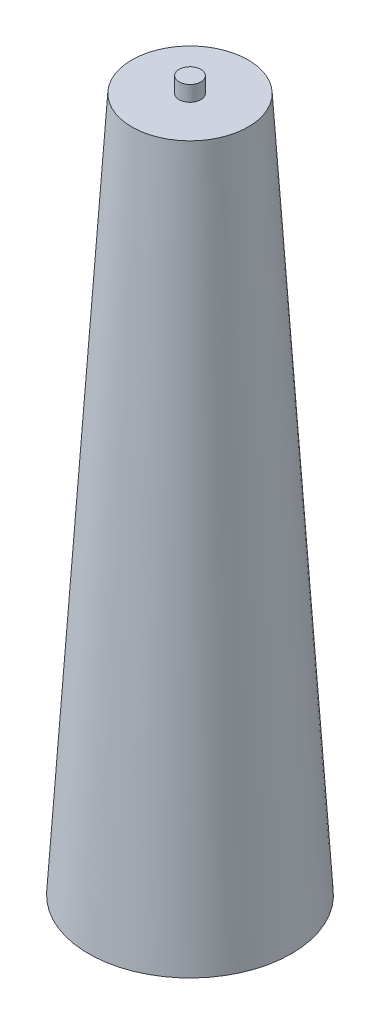
ISO-10303-21;
HEADER;
FILE_DESCRIPTION(('STEP AP214'),'2;1');
FILE_NAME('part.step','',(''),(''),'','','');
FILE_SCHEMA(('AUTOMOTIVE_DESIGN { 1 0 10303 214 1 1 1 1 }'));
ENDSEC;
DATA;
#1=APPLICATION_CONTEXT('core data for automotive mechanical design processes');
#2=APPLICATION_PROTOCOL_DEFINITION('international standard','automotive_design',2000,#1);
#3=PRODUCT_CONTEXT('',#1,'mechanical');
#4=PRODUCT('Part','Part','',(#3));
#5=PRODUCT_RELATED_PRODUCT_CATEGORY('part','',(#4));
#6=PRODUCT_DEFINITION_FORMATION('','',#4);
#7=PRODUCT_DEFINITION_CONTEXT('part definition',#1,'design');
#8=PRODUCT_DEFINITION('design','',#6,#7);
#9=PRODUCT_DEFINITION_SHAPE('','',#8);
#10=(LENGTH_UNIT() NAMED_UNIT(*) SI_UNIT(.MILLI.,.METRE.));
#11=(NAMED_UNIT(*) PLANE_ANGLE_UNIT() SI_UNIT($,.RADIAN.));
#12=(NAMED_UNIT(*) SI_UNIT($,.STERADIAN.) SOLID_ANGLE_UNIT());
#13=UNCERTAINTY_MEASURE_WITH_UNIT(LENGTH_MEASURE(1.E-05),#10,'distance_accuracy_value','');
#14=(GEOMETRIC_REPRESENTATION_CONTEXT(3) GLOBAL_UNCERTAINTY_ASSIGNED_CONTEXT((#13)) GLOBAL_UNIT_ASSIGNED_CONTEXT((#10,
#11,#12)) REPRESENTATION_CONTEXT('',''));
#15=CARTESIAN_POINT('',(0.,0.,0.));
#16=DIRECTION('',(0.,0.,1.));
#17=DIRECTION('',(1.,0.,0.));
#18=AXIS2_PLACEMENT_3D('',#15,#16,#17);
#19=CARTESIAN_POINT('',(0.,0.,0.));
#20=DIRECTION('',(0.,-1.,0.));
#21=DIRECTION('',(1.,0.,0.));
#22=AXIS2_PLACEMENT_3D('',#19,#20,#21);
#23=PLANE('',#22);
#24=CARTESIAN_POINT('',(0.,0.,0.));
#25=DIRECTION('',(0.,-1.,0.));
#26=DIRECTION('',(1.,0.,0.));
#27=AXIS2_PLACEMENT_3D('',#24,#25,#26);
#28=CIRCLE('',#27,3.5814);
#29=CARTESIAN_POINT('',(3.5814,0.,0.));
#30=VERTEX_POINT('',#29);
#31=EDGE_CURVE('E95',#30,#30,#28,.T.);
#32=ORIENTED_EDGE('',*,*,#31,.F.);
#33=EDGE_LOOP('',(#32));
#34=FACE_BOUND('',#33,.T.);
#35=CARTESIAN_POINT('',(0.,0.,0.));
#36=DIRECTION('',(0.,1.,0.));
#37=DIRECTION('',(-1.,0.,0.));
#38=AXIS2_PLACEMENT_3D('',#35,#36,#37);
#39=CIRCLE('',#38,33.401);
#40=CARTESIAN_POINT('',(-33.401,0.,0.));
#41=VERTEX_POINT('',#40);
#42=EDGE_CURVE('E64',#41,#41,#39,.T.);
#43=ORIENTED_EDGE('',*,*,#42,.F.);
#44=EDGE_LOOP('',(#43));
#45=FACE_BOUND('',#44,.T.);
#46=ADVANCED_FACE('F46',(#34,#45),#23,.T.);
#47=CARTESIAN_POINT('',(0.,228.6,0.));
#48=DIRECTION('',(0.,-1.,0.));
#49=DIRECTION('',(1.,0.,0.));
#50=AXIS2_PLACEMENT_3D('',#47,#48,#49);
#51=CONICAL_SURFACE('',#50,19.1388715805443,0.0623082542961904);
#52=ORIENTED_EDGE('',*,*,#42,.T.);
#53=EDGE_LOOP('',(#52));
#54=FACE_BOUND('',#53,.T.);
#55=CARTESIAN_POINT('',(0.,228.6,0.));
#56=DIRECTION('',(0.,1.,0.));
#57=DIRECTION('',(-1.,0.,0.));
#58=AXIS2_PLACEMENT_3D('',#55,#56,#57);
#59=CIRCLE('',#58,19.1388715805443);
#60=CARTESIAN_POINT('',(-19.1388715805443,228.6,0.));
#61=VERTEX_POINT('',#60);
#62=EDGE_CURVE('E84',#61,#61,#59,.T.);
#63=ORIENTED_EDGE('',*,*,#62,.F.);
#64=EDGE_LOOP('',(#63));
#65=FACE_BOUND('',#64,.T.);
#66=ADVANCED_FACE('F106',(#54,#65),#51,.T.);
#67=CARTESIAN_POINT('',(-19.1388715805443,228.6,0.));
#68=DIRECTION('',(0.,1.,0.));
#69=DIRECTION('',(-1.,0.,0.));
#70=AXIS2_PLACEMENT_3D('',#67,#68,#69);
#71=PLANE('',#70);
#72=CARTESIAN_POINT('',(0.,228.6,0.));
#73=DIRECTION('',(0.,1.,0.));
#74=DIRECTION('',(-1.,0.,0.));
#75=AXIS2_PLACEMENT_3D('',#72,#73,#74);
#76=CIRCLE('',#75,3.5814);
#77=CARTESIAN_POINT('',(-3.58140000000002,228.6,0.));
#78=VERTEX_POINT('',#77);
#79=EDGE_CURVE('E75',#78,#78,#76,.T.);
#80=ORIENTED_EDGE('',*,*,#79,.F.);
#81=EDGE_LOOP('',(#80));
#82=FACE_BOUND('',#81,.T.);
#83=ORIENTED_EDGE('',*,*,#62,.T.);
#84=EDGE_LOOP('',(#83));
#85=FACE_BOUND('',#84,.T.);
#86=ADVANCED_FACE('F115',(#82,#85),#71,.T.);
#87=CARTESIAN_POINT('',(0.,233.68,0.));
#88=DIRECTION('',(0.,-1.,0.));
#89=DIRECTION('',(1.,0.,0.));
#90=AXIS2_PLACEMENT_3D('',#87,#88,#89);
#91=CYLINDRICAL_SURFACE('',#90,3.5814);
#92=CARTESIAN_POINT('',(0.,233.68,0.));
#93=DIRECTION('',(0.,1.,0.));
#94=DIRECTION('',(-1.,0.,0.));
#95=AXIS2_PLACEMENT_3D('',#92,#93,#94);
#96=CIRCLE('',#95,3.5814);
#97=CARTESIAN_POINT('',(-3.58140000000002,233.68,0.));
#98=VERTEX_POINT('',#97);
#99=EDGE_CURVE('E83',#98,#98,#96,.T.);
#100=ORIENTED_EDGE('',*,*,#99,.F.);
#101=EDGE_LOOP('',(#100));
#102=FACE_BOUND('',#101,.T.);
#103=ORIENTED_EDGE('',*,*,#79,.T.);
#104=EDGE_LOOP('',(#103));
#105=FACE_BOUND('',#104,.T.);
#106=ADVANCED_FACE('F120',(#102,#105),#91,.T.);
#107=CARTESIAN_POINT('',(0.,233.68,0.));
#108=DIRECTION('',(0.,1.,0.));
#109=DIRECTION('',(-1.,0.,0.));
#110=AXIS2_PLACEMENT_3D('',#107,#108,#109);
#111=PLANE('',#110);
#112=ORIENTED_EDGE('',*,*,#99,.T.);
#113=EDGE_LOOP('',(#112));
#114=FACE_BOUND('',#113,.T.);
#115=ADVANCED_FACE('F205',(#114),#111,.T.);
#116=CARTESIAN_POINT('',(0.,5.08,0.));
#117=DIRECTION('',(0.,-1.,0.));
#118=DIRECTION('',(1.,0.,0.));
#119=AXIS2_PLACEMENT_3D('',#116,#117,#118);
#120=CYLINDRICAL_SURFACE('',#119,3.5814);
#121=CARTESIAN_POINT('',(0.,5.08,0.));
#122=DIRECTION('',(0.,-1.,0.));
#123=DIRECTION('',(1.,0.,0.));
#124=AXIS2_PLACEMENT_3D('',#121,#122,#123);
#125=CIRCLE('',#124,3.5814);
#126=CARTESIAN_POINT('',(3.5814,5.08,0.));
#127=VERTEX_POINT('',#126);
#128=EDGE_CURVE('E91',#127,#127,#125,.T.);
#129=ORIENTED_EDGE('',*,*,#128,.F.);
#130=EDGE_LOOP('',(#129));
#131=FACE_BOUND('',#130,.T.);
#132=ORIENTED_EDGE('',*,*,#31,.T.);
#133=EDGE_LOOP('',(#132));
#134=FACE_BOUND('',#133,.T.);
#135=ADVANCED_FACE('F105',(#131,#134),#120,.F.);
#136=CARTESIAN_POINT('',(0.,5.08,0.));
#137=DIRECTION('',(0.,-1.,0.));
#138=DIRECTION('',(1.,0.,0.));
#139=AXIS2_PLACEMENT_3D('',#136,#137,#138);
#140=PLANE('',#139);
#141=ORIENTED_EDGE('',*,*,#128,.T.);
#142=EDGE_LOOP('',(#141));
#143=FACE_BOUND('',#142,.T.);
#144=ADVANCED_FACE('F194',(#143),#140,.T.);
#145=CLOSED_SHELL('',(#46,#66,#86,#106,#115,#135,#144));
#146=CARTESIAN_POINT('',(0.,2.54,0.));
#147=DIRECTION('',(0.,-1.,0.));
#148=DIRECTION('',(1.,0.,0.));
#149=AXIS2_PLACEMENT_3D('',#146,#147,#148);
#150=PLANE('',#149);
#151=CARTESIAN_POINT('',(0.,2.54,0.));
#152=DIRECTION('',(0.,-1.,0.));
#153=DIRECTION('',(1.,0.,0.));
#154=AXIS2_PLACEMENT_3D('',#151,#152,#153);
#155=CIRCLE('',#154,6.1214);
#156=CARTESIAN_POINT('',(6.1214,2.54,0.));
#157=VERTEX_POINT('',#156);
#158=EDGE_CURVE('E54',#157,#157,#155,.T.);
#159=ORIENTED_EDGE('',*,*,#158,.T.);
#160=EDGE_LOOP('',(#159));
#161=FACE_BOUND('',#160,.T.);
#162=CARTESIAN_POINT('',(0.,2.53999999999999,0.));
#163=DIRECTION('',(0.,-1.,0.));
#164=DIRECTION('',(1.,0.,0.));
#165=AXIS2_PLACEMENT_3D('',#162,#163,#164);
#166=CIRCLE('',#165,30.6975933734652);
#167=CARTESIAN_POINT('',(30.6975933734652,2.53999999999999,0.));
#168=VERTEX_POINT('',#167);
#169=EDGE_CURVE('E49',#168,#168,#166,.F.);
#170=ORIENTED_EDGE('',*,*,#169,.T.);
#171=EDGE_LOOP('',(#170));
#172=FACE_BOUND('',#171,.T.);
#173=ADVANCED_FACE('F125',(#161,#172),#150,.F.);
#174=CARTESIAN_POINT('',(0.,228.441839418753,0.));
#175=DIRECTION('',(0.,-1.,0.));
#176=DIRECTION('',(1.,0.,0.));
#177=AXIS2_PLACEMENT_3D('',#174,#175,#176);
#178=CONICAL_SURFACE('',#177,16.6038005301515,0.0623082542961904);
#179=ORIENTED_EDGE('',*,*,#169,.F.);
#180=EDGE_LOOP('',(#179));
#181=FACE_BOUND('',#180,.T.);
#182=CARTESIAN_POINT('',(0.,226.06,0.));
#183=DIRECTION('',(0.,1.,0.));
#184=DIRECTION('',(-1.,0.,0.));
#185=AXIS2_PLACEMENT_3D('',#182,#183,#184);
#186=CIRCLE('',#185,16.7524011411086);
#187=CARTESIAN_POINT('',(-16.7524011411086,226.06,0.));
#188=VERTEX_POINT('',#187);
#189=EDGE_CURVE('E69',#188,#188,#186,.T.);
#190=ORIENTED_EDGE('',*,*,#189,.T.);
#191=EDGE_LOOP('',(#190));
#192=FACE_BOUND('',#191,.T.);
#193=ADVANCED_FACE('F123',(#181,#192),#178,.F.);
#194=CARTESIAN_POINT('',(-19.1388715805443,226.06,0.));
#195=DIRECTION('',(0.,1.,0.));
#196=DIRECTION('',(-1.,0.,0.));
#197=AXIS2_PLACEMENT_3D('',#194,#195,#196);
#198=PLANE('',#197);
#199=CARTESIAN_POINT('',(0.,226.06,0.));
#200=DIRECTION('',(0.,1.,0.));
#201=DIRECTION('',(-1.,0.,0.));
#202=AXIS2_PLACEMENT_3D('',#199,#200,#201);
#203=CIRCLE('',#202,1.0414);
#204=CARTESIAN_POINT('',(-1.04140000000002,226.06,0.));
#205=VERTEX_POINT('',#204);
#206=EDGE_CURVE('E67',#205,#205,#203,.T.);
#207=ORIENTED_EDGE('',*,*,#206,.T.);
#208=EDGE_LOOP('',(#207));
#209=FACE_BOUND('',#208,.T.);
#210=ORIENTED_EDGE('',*,*,#189,.F.);
#211=EDGE_LOOP('',(#210));
#212=FACE_BOUND('',#211,.T.);
#213=ADVANCED_FACE('F128',(#209,#212),#198,.F.);
#214=CARTESIAN_POINT('',(0.,233.68,0.));
#215=DIRECTION('',(0.,-1.,0.));
#216=DIRECTION('',(1.,0.,0.));
#217=AXIS2_PLACEMENT_3D('',#214,#215,#216);
#218=CYLINDRICAL_SURFACE('',#217,1.0414);
#219=CARTESIAN_POINT('',(0.,231.14,0.));
#220=DIRECTION('',(0.,1.,0.));
#221=DIRECTION('',(-1.,0.,0.));
#222=AXIS2_PLACEMENT_3D('',#219,#220,#221);
#223=CIRCLE('',#222,1.0414);
#224=CARTESIAN_POINT('',(-1.04140000000002,231.14,0.));
#225=VERTEX_POINT('',#224);
#226=EDGE_CURVE('E58',#225,#225,#223,.T.);
#227=ORIENTED_EDGE('',*,*,#226,.T.);
#228=EDGE_LOOP('',(#227));
#229=FACE_BOUND('',#228,.T.);
#230=ORIENTED_EDGE('',*,*,#206,.F.);
#231=EDGE_LOOP('',(#230));
#232=FACE_BOUND('',#231,.T.);
#233=ADVANCED_FACE('F133',(#229,#232),#218,.F.);
#234=CARTESIAN_POINT('',(0.,231.14,0.));
#235=DIRECTION('',(0.,1.,0.));
#236=DIRECTION('',(-1.,0.,0.));
#237=AXIS2_PLACEMENT_3D('',#234,#235,#236);
#238=PLANE('',#237);
#239=ORIENTED_EDGE('',*,*,#226,.F.);
#240=EDGE_LOOP('',(#239));
#241=FACE_BOUND('',#240,.T.);
#242=ADVANCED_FACE('F139',(#241),#238,.F.);
#243=CARTESIAN_POINT('',(0.,5.08,0.));
#244=DIRECTION('',(0.,-1.,0.));
#245=DIRECTION('',(1.,0.,0.));
#246=AXIS2_PLACEMENT_3D('',#243,#244,#245);
#247=CYLINDRICAL_SURFACE('',#246,6.1214);
#248=CARTESIAN_POINT('',(0.,7.62,0.));
#249=DIRECTION('',(0.,-1.,0.));
#250=DIRECTION('',(1.,0.,0.));
#251=AXIS2_PLACEMENT_3D('',#248,#249,#250);
#252=CIRCLE('',#251,6.1214);
#253=CARTESIAN_POINT('',(6.1214,7.62,0.));
#254=VERTEX_POINT('',#253);
#255=EDGE_CURVE('E10',#254,#254,#252,.T.);
#256=ORIENTED_EDGE('',*,*,#255,.T.);
#257=EDGE_LOOP('',(#256));
#258=FACE_BOUND('',#257,.T.);
#259=ORIENTED_EDGE('',*,*,#158,.F.);
#260=EDGE_LOOP('',(#259));
#261=FACE_BOUND('',#260,.T.);
#262=ADVANCED_FACE('F142',(#258,#261),#247,.T.);
#263=CARTESIAN_POINT('',(0.,7.62,0.));
#264=DIRECTION('',(0.,-1.,0.));
#265=DIRECTION('',(1.,0.,0.));
#266=AXIS2_PLACEMENT_3D('',#263,#264,#265);
#267=PLANE('',#266);
#268=ORIENTED_EDGE('',*,*,#255,.F.);
#269=EDGE_LOOP('',(#268));
#270=FACE_BOUND('',#269,.T.);
#271=ADVANCED_FACE('F48',(#270),#267,.F.);
#272=CLOSED_SHELL('',(#173,#193,#213,#233,#242,#262,#271));
#273=ORIENTED_CLOSED_SHELL('',*,#272,.T.);
#274=BREP_WITH_VOIDS('B2',#145,(#273));
#275=ADVANCED_BREP_SHAPE_REPRESENTATION('',(#18,#274),#14);
#276=SHAPE_DEFINITION_REPRESENTATION(#9,#275);
ENDSEC;
END-ISO-10303-21;
